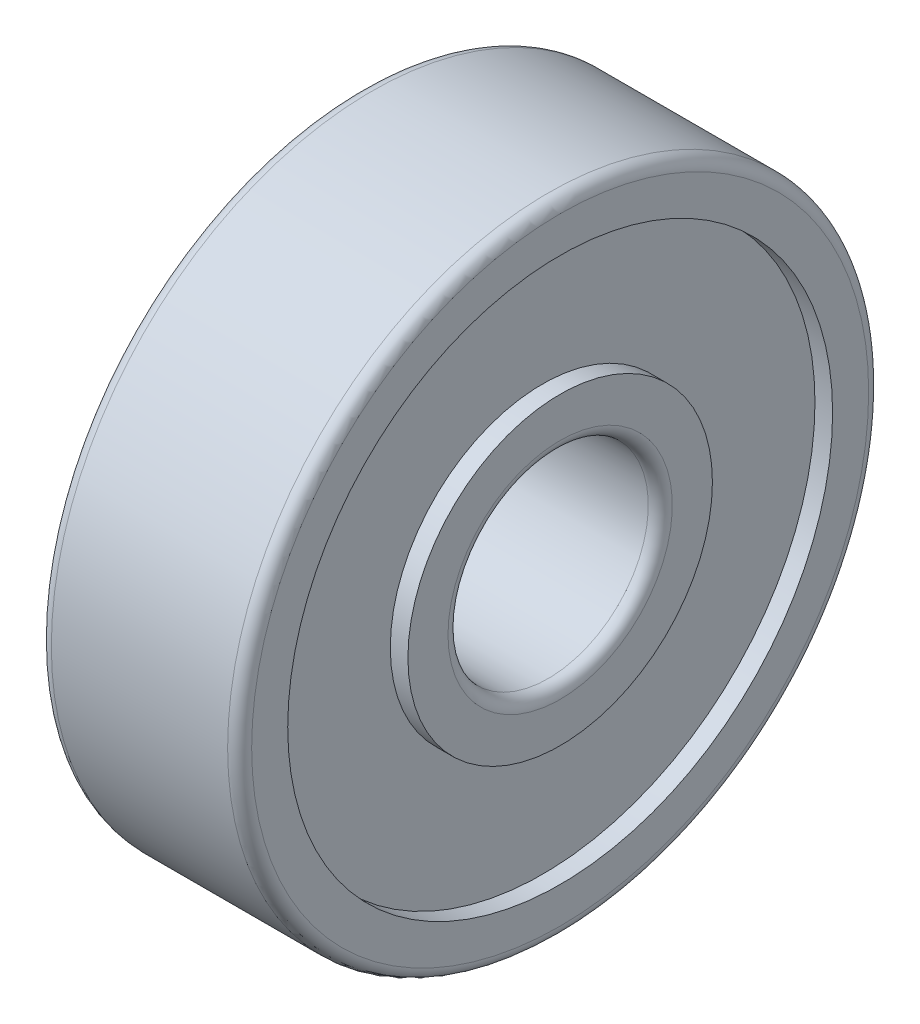
ISO-10303-21;
HEADER;
FILE_DESCRIPTION(('STEP AP214'),'2;1');
FILE_NAME('part.step','',(''),(''),'','','');
FILE_SCHEMA(('AUTOMOTIVE_DESIGN { 1 0 10303 214 1 1 1 1 }'));
ENDSEC;
DATA;
#1=APPLICATION_CONTEXT('core data for automotive mechanical design processes');
#2=APPLICATION_PROTOCOL_DEFINITION('international standard','automotive_design',2000,#1);
#3=PRODUCT_CONTEXT('',#1,'mechanical');
#4=PRODUCT('Part','Part','',(#3));
#5=PRODUCT_RELATED_PRODUCT_CATEGORY('part','',(#4));
#6=PRODUCT_DEFINITION_FORMATION('','',#4);
#7=PRODUCT_DEFINITION_CONTEXT('part definition',#1,'design');
#8=PRODUCT_DEFINITION('design','',#6,#7);
#9=PRODUCT_DEFINITION_SHAPE('','',#8);
#10=(LENGTH_UNIT() NAMED_UNIT(*) SI_UNIT(.MILLI.,.METRE.));
#11=(NAMED_UNIT(*) PLANE_ANGLE_UNIT() SI_UNIT($,.RADIAN.));
#12=(NAMED_UNIT(*) SI_UNIT($,.STERADIAN.) SOLID_ANGLE_UNIT());
#13=UNCERTAINTY_MEASURE_WITH_UNIT(LENGTH_MEASURE(1.E-05),#10,'distance_accuracy_value','');
#14=(GEOMETRIC_REPRESENTATION_CONTEXT(3) GLOBAL_UNCERTAINTY_ASSIGNED_CONTEXT((#13)) GLOBAL_UNIT_ASSIGNED_CONTEXT((#10,
#11,#12)) REPRESENTATION_CONTEXT('',''));
#15=CARTESIAN_POINT('',(0.,0.,0.));
#16=DIRECTION('',(0.,0.,1.));
#17=DIRECTION('',(1.,0.,0.));
#18=AXIS2_PLACEMENT_3D('',#15,#16,#17);
#19=CARTESIAN_POINT('',(0.299999999999941,0.,0.));
#20=DIRECTION('',(-1.,0.,0.));
#21=DIRECTION('',(0.,0.,1.));
#22=AXIS2_PLACEMENT_3D('',#19,#20,#21);
#23=TOROIDAL_SURFACE('',#22,7.70000000000006,0.299999999999941);
#24=CARTESIAN_POINT('',(0.,0.,0.));
#25=DIRECTION('',(-1.,0.,0.));
#26=DIRECTION('',(0.,0.,1.));
#27=AXIS2_PLACEMENT_3D('',#24,#25,#26);
#28=CIRCLE('',#27,7.7);
#29=CARTESIAN_POINT('',(0.,0.,7.7));
#30=VERTEX_POINT('',#29);
#31=EDGE_CURVE('E10',#30,#30,#28,.T.);
#32=ORIENTED_EDGE('',*,*,#31,.F.);
#33=EDGE_LOOP('',(#32));
#34=FACE_BOUND('',#33,.T.);
#35=CARTESIAN_POINT('',(0.3,0.,0.));
#36=DIRECTION('',(-1.,0.,0.));
#37=DIRECTION('',(0.,0.,1.));
#38=AXIS2_PLACEMENT_3D('',#35,#36,#37);
#39=CIRCLE('',#38,8.);
#40=CARTESIAN_POINT('',(0.3,0.,8.));
#41=VERTEX_POINT('',#40);
#42=EDGE_CURVE('E83',#41,#41,#39,.T.);
#43=ORIENTED_EDGE('',*,*,#42,.T.);
#44=EDGE_LOOP('',(#43));
#45=FACE_BOUND('',#44,.T.);
#46=ADVANCED_FACE('F31',(#34,#45),#23,.T.);
#47=CARTESIAN_POINT('',(0.,7.7,0.));
#48=DIRECTION('',(1.,0.,0.));
#49=DIRECTION('',(0.,0.,-1.));
#50=AXIS2_PLACEMENT_3D('',#47,#48,#49);
#51=PLANE('',#50);
#52=CARTESIAN_POINT('',(0.,0.,0.));
#53=DIRECTION('',(-1.,0.,0.));
#54=DIRECTION('',(0.,0.,1.));
#55=AXIS2_PLACEMENT_3D('',#52,#53,#54);
#56=CIRCLE('',#55,6.8);
#57=CARTESIAN_POINT('',(0.,0.,6.8));
#58=VERTEX_POINT('',#57);
#59=EDGE_CURVE('E37',#58,#58,#56,.T.);
#60=ORIENTED_EDGE('',*,*,#59,.F.);
#61=EDGE_LOOP('',(#60));
#62=FACE_BOUND('',#61,.T.);
#63=ORIENTED_EDGE('',*,*,#31,.T.);
#64=EDGE_LOOP('',(#63));
#65=FACE_BOUND('',#64,.T.);
#66=ADVANCED_FACE('F168',(#62,#65),#51,.F.);
#67=CARTESIAN_POINT('',(4.7,0.,0.));
#68=DIRECTION('',(-1.,0.,0.));
#69=DIRECTION('',(0.,0.,1.));
#70=AXIS2_PLACEMENT_3D('',#67,#68,#69);
#71=CYLINDRICAL_SURFACE('',#70,6.8);
#72=CARTESIAN_POINT('',(0.44,0.,0.));
#73=DIRECTION('',(-1.,0.,0.));
#74=DIRECTION('',(0.,0.,1.));
#75=AXIS2_PLACEMENT_3D('',#72,#73,#74);
#76=CIRCLE('',#75,6.8);
#77=CARTESIAN_POINT('',(0.44,0.,6.8));
#78=VERTEX_POINT('',#77);
#79=EDGE_CURVE('E41',#78,#78,#76,.T.);
#80=ORIENTED_EDGE('',*,*,#79,.F.);
#81=EDGE_LOOP('',(#80));
#82=FACE_BOUND('',#81,.T.);
#83=ORIENTED_EDGE('',*,*,#59,.T.);
#84=EDGE_LOOP('',(#83));
#85=FACE_BOUND('',#84,.T.);
#86=ADVANCED_FACE('F163',(#82,#85),#71,.F.);
#87=CARTESIAN_POINT('',(0.44,6.8,0.));
#88=DIRECTION('',(1.,0.,0.));
#89=DIRECTION('',(0.,0.,-1.));
#90=AXIS2_PLACEMENT_3D('',#87,#88,#89);
#91=PLANE('',#90);
#92=CARTESIAN_POINT('',(0.44,0.,0.));
#93=DIRECTION('',(-1.,0.,0.));
#94=DIRECTION('',(0.,0.,1.));
#95=AXIS2_PLACEMENT_3D('',#92,#93,#94);
#96=CIRCLE('',#95,3.8);
#97=CARTESIAN_POINT('',(0.44,0.,3.8));
#98=VERTEX_POINT('',#97);
#99=EDGE_CURVE('E45',#98,#98,#96,.T.);
#100=ORIENTED_EDGE('',*,*,#99,.F.);
#101=EDGE_LOOP('',(#100));
#102=FACE_BOUND('',#101,.T.);
#103=ORIENTED_EDGE('',*,*,#79,.T.);
#104=EDGE_LOOP('',(#103));
#105=FACE_BOUND('',#104,.T.);
#106=ADVANCED_FACE('F157',(#102,#105),#91,.F.);
#107=CARTESIAN_POINT('',(4.7,0.,0.));
#108=DIRECTION('',(-1.,0.,0.));
#109=DIRECTION('',(0.,0.,1.));
#110=AXIS2_PLACEMENT_3D('',#107,#108,#109);
#111=CYLINDRICAL_SURFACE('',#110,3.8);
#112=CARTESIAN_POINT('',(0.,0.,0.));
#113=DIRECTION('',(-1.,0.,0.));
#114=DIRECTION('',(0.,0.,1.));
#115=AXIS2_PLACEMENT_3D('',#112,#113,#114);
#116=CIRCLE('',#115,3.8);
#117=CARTESIAN_POINT('',(0.,0.,3.8));
#118=VERTEX_POINT('',#117);
#119=EDGE_CURVE('E50',#118,#118,#116,.T.);
#120=ORIENTED_EDGE('',*,*,#119,.F.);
#121=EDGE_LOOP('',(#120));
#122=FACE_BOUND('',#121,.T.);
#123=ORIENTED_EDGE('',*,*,#99,.T.);
#124=EDGE_LOOP('',(#123));
#125=FACE_BOUND('',#124,.T.);
#126=ADVANCED_FACE('F151',(#122,#125),#111,.T.);
#127=CARTESIAN_POINT('',(0.,3.8,0.));
#128=DIRECTION('',(1.,0.,0.));
#129=DIRECTION('',(0.,0.,-1.));
#130=AXIS2_PLACEMENT_3D('',#127,#128,#129);
#131=PLANE('',#130);
#132=CARTESIAN_POINT('',(0.,0.,0.));
#133=DIRECTION('',(-1.,0.,0.));
#134=DIRECTION('',(0.,0.,1.));
#135=AXIS2_PLACEMENT_3D('',#132,#133,#134);
#136=CIRCLE('',#135,2.8);
#137=CARTESIAN_POINT('',(0.,0.,2.8));
#138=VERTEX_POINT('',#137);
#139=EDGE_CURVE('E53',#138,#138,#136,.T.);
#140=ORIENTED_EDGE('',*,*,#139,.F.);
#141=EDGE_LOOP('',(#140));
#142=FACE_BOUND('',#141,.T.);
#143=ORIENTED_EDGE('',*,*,#119,.T.);
#144=EDGE_LOOP('',(#143));
#145=FACE_BOUND('',#144,.T.);
#146=ADVANCED_FACE('F145',(#142,#145),#131,.F.);
#147=CARTESIAN_POINT('',(0.299999999999939,0.,0.));
#148=DIRECTION('',(-1.,0.,0.));
#149=DIRECTION('',(0.,0.,1.));
#150=AXIS2_PLACEMENT_3D('',#147,#148,#149);
#151=TOROIDAL_SURFACE('',#150,2.79999999999994,0.299999999999939);
#152=CARTESIAN_POINT('',(0.3,0.,0.));
#153=DIRECTION('',(-1.,0.,0.));
#154=DIRECTION('',(0.,0.,1.));
#155=AXIS2_PLACEMENT_3D('',#152,#153,#154);
#156=CIRCLE('',#155,2.5);
#157=CARTESIAN_POINT('',(0.3,0.,2.5));
#158=VERTEX_POINT('',#157);
#159=EDGE_CURVE('E56',#158,#158,#156,.T.);
#160=ORIENTED_EDGE('',*,*,#159,.F.);
#161=EDGE_LOOP('',(#160));
#162=FACE_BOUND('',#161,.T.);
#163=ORIENTED_EDGE('',*,*,#139,.T.);
#164=EDGE_LOOP('',(#163));
#165=FACE_BOUND('',#164,.T.);
#166=ADVANCED_FACE('F139',(#162,#165),#151,.T.);
#167=CARTESIAN_POINT('',(4.7,0.,0.));
#168=DIRECTION('',(-1.,0.,0.));
#169=DIRECTION('',(0.,0.,1.));
#170=AXIS2_PLACEMENT_3D('',#167,#168,#169);
#171=CYLINDRICAL_SURFACE('',#170,2.5);
#172=CARTESIAN_POINT('',(4.7,0.,0.));
#173=DIRECTION('',(-1.,0.,0.));
#174=DIRECTION('',(0.,0.,1.));
#175=AXIS2_PLACEMENT_3D('',#172,#173,#174);
#176=CIRCLE('',#175,2.5);
#177=CARTESIAN_POINT('',(4.7,0.,2.5));
#178=VERTEX_POINT('',#177);
#179=EDGE_CURVE('E59',#178,#178,#176,.T.);
#180=ORIENTED_EDGE('',*,*,#179,.F.);
#181=EDGE_LOOP('',(#180));
#182=FACE_BOUND('',#181,.T.);
#183=ORIENTED_EDGE('',*,*,#159,.T.);
#184=EDGE_LOOP('',(#183));
#185=FACE_BOUND('',#184,.T.);
#186=ADVANCED_FACE('F133',(#182,#185),#171,.F.);
#187=CARTESIAN_POINT('',(4.70000000000012,0.,0.));
#188=DIRECTION('',(-1.,0.,0.));
#189=DIRECTION('',(0.,0.,1.));
#190=AXIS2_PLACEMENT_3D('',#187,#188,#189);
#191=TOROIDAL_SURFACE('',#190,2.79999999999988,0.299999999999878);
#192=CARTESIAN_POINT('',(5.,0.,0.));
#193=DIRECTION('',(-1.,0.,0.));
#194=DIRECTION('',(0.,0.,1.));
#195=AXIS2_PLACEMENT_3D('',#192,#193,#194);
#196=CIRCLE('',#195,2.8);
#197=CARTESIAN_POINT('',(5.,0.,2.8));
#198=VERTEX_POINT('',#197);
#199=EDGE_CURVE('E62',#198,#198,#196,.T.);
#200=ORIENTED_EDGE('',*,*,#199,.F.);
#201=EDGE_LOOP('',(#200));
#202=FACE_BOUND('',#201,.T.);
#203=ORIENTED_EDGE('',*,*,#179,.T.);
#204=EDGE_LOOP('',(#203));
#205=FACE_BOUND('',#204,.T.);
#206=ADVANCED_FACE('F127',(#202,#205),#191,.T.);
#207=CARTESIAN_POINT('',(5.,2.8,0.));
#208=DIRECTION('',(-1.,0.,0.));
#209=DIRECTION('',(0.,0.,1.));
#210=AXIS2_PLACEMENT_3D('',#207,#208,#209);
#211=PLANE('',#210);
#212=CARTESIAN_POINT('',(5.,0.,0.));
#213=DIRECTION('',(-1.,0.,0.));
#214=DIRECTION('',(0.,0.,1.));
#215=AXIS2_PLACEMENT_3D('',#212,#213,#214);
#216=CIRCLE('',#215,3.8);
#217=CARTESIAN_POINT('',(5.,0.,3.8));
#218=VERTEX_POINT('',#217);
#219=EDGE_CURVE('E65',#218,#218,#216,.T.);
#220=ORIENTED_EDGE('',*,*,#219,.F.);
#221=EDGE_LOOP('',(#220));
#222=FACE_BOUND('',#221,.T.);
#223=ORIENTED_EDGE('',*,*,#199,.T.);
#224=EDGE_LOOP('',(#223));
#225=FACE_BOUND('',#224,.T.);
#226=ADVANCED_FACE('F121',(#222,#225),#211,.F.);
#227=CARTESIAN_POINT('',(4.7,0.,0.));
#228=DIRECTION('',(-1.,0.,0.));
#229=DIRECTION('',(0.,0.,1.));
#230=AXIS2_PLACEMENT_3D('',#227,#228,#229);
#231=CYLINDRICAL_SURFACE('',#230,3.8);
#232=CARTESIAN_POINT('',(4.56,0.,0.));
#233=DIRECTION('',(-1.,0.,0.));
#234=DIRECTION('',(0.,0.,1.));
#235=AXIS2_PLACEMENT_3D('',#232,#233,#234);
#236=CIRCLE('',#235,3.8);
#237=CARTESIAN_POINT('',(4.56,0.,3.8));
#238=VERTEX_POINT('',#237);
#239=EDGE_CURVE('E68',#238,#238,#236,.T.);
#240=ORIENTED_EDGE('',*,*,#239,.F.);
#241=EDGE_LOOP('',(#240));
#242=FACE_BOUND('',#241,.T.);
#243=ORIENTED_EDGE('',*,*,#219,.T.);
#244=EDGE_LOOP('',(#243));
#245=FACE_BOUND('',#244,.T.);
#246=ADVANCED_FACE('F115',(#242,#245),#231,.T.);
#247=CARTESIAN_POINT('',(4.56,3.8,0.));
#248=DIRECTION('',(-1.,0.,0.));
#249=DIRECTION('',(0.,0.,1.));
#250=AXIS2_PLACEMENT_3D('',#247,#248,#249);
#251=PLANE('',#250);
#252=CARTESIAN_POINT('',(4.56,0.,0.));
#253=DIRECTION('',(-1.,0.,0.));
#254=DIRECTION('',(0.,0.,1.));
#255=AXIS2_PLACEMENT_3D('',#252,#253,#254);
#256=CIRCLE('',#255,6.8);
#257=CARTESIAN_POINT('',(4.56,0.,6.8));
#258=VERTEX_POINT('',#257);
#259=EDGE_CURVE('E71',#258,#258,#256,.T.);
#260=ORIENTED_EDGE('',*,*,#259,.F.);
#261=EDGE_LOOP('',(#260));
#262=FACE_BOUND('',#261,.T.);
#263=ORIENTED_EDGE('',*,*,#239,.T.);
#264=EDGE_LOOP('',(#263));
#265=FACE_BOUND('',#264,.T.);
#266=ADVANCED_FACE('F109',(#262,#265),#251,.F.);
#267=CARTESIAN_POINT('',(4.7,0.,0.));
#268=DIRECTION('',(-1.,0.,0.));
#269=DIRECTION('',(0.,0.,1.));
#270=AXIS2_PLACEMENT_3D('',#267,#268,#269);
#271=CYLINDRICAL_SURFACE('',#270,6.8);
#272=CARTESIAN_POINT('',(5.,0.,0.));
#273=DIRECTION('',(-1.,0.,0.));
#274=DIRECTION('',(0.,0.,1.));
#275=AXIS2_PLACEMENT_3D('',#272,#273,#274);
#276=CIRCLE('',#275,6.8);
#277=CARTESIAN_POINT('',(5.,0.,6.8));
#278=VERTEX_POINT('',#277);
#279=EDGE_CURVE('E74',#278,#278,#276,.T.);
#280=ORIENTED_EDGE('',*,*,#279,.F.);
#281=EDGE_LOOP('',(#280));
#282=FACE_BOUND('',#281,.T.);
#283=ORIENTED_EDGE('',*,*,#259,.T.);
#284=EDGE_LOOP('',(#283));
#285=FACE_BOUND('',#284,.T.);
#286=ADVANCED_FACE('F103',(#282,#285),#271,.F.);
#287=CARTESIAN_POINT('',(5.,6.8,0.));
#288=DIRECTION('',(-1.,0.,0.));
#289=DIRECTION('',(0.,0.,1.));
#290=AXIS2_PLACEMENT_3D('',#287,#288,#289);
#291=PLANE('',#290);
#292=CARTESIAN_POINT('',(5.,0.,0.));
#293=DIRECTION('',(-1.,0.,0.));
#294=DIRECTION('',(0.,0.,1.));
#295=AXIS2_PLACEMENT_3D('',#292,#293,#294);
#296=CIRCLE('',#295,7.7);
#297=CARTESIAN_POINT('',(5.,0.,7.7));
#298=VERTEX_POINT('',#297);
#299=EDGE_CURVE('E77',#298,#298,#296,.T.);
#300=ORIENTED_EDGE('',*,*,#299,.F.);
#301=EDGE_LOOP('',(#300));
#302=FACE_BOUND('',#301,.T.);
#303=ORIENTED_EDGE('',*,*,#279,.T.);
#304=EDGE_LOOP('',(#303));
#305=FACE_BOUND('',#304,.T.);
#306=ADVANCED_FACE('F97',(#302,#305),#291,.F.);
#307=CARTESIAN_POINT('',(4.70000000000012,0.,0.));
#308=DIRECTION('',(-1.,0.,0.));
#309=DIRECTION('',(0.,0.,1.));
#310=AXIS2_PLACEMENT_3D('',#307,#308,#309);
#311=TOROIDAL_SURFACE('',#310,7.70000000000012,0.299999999999879);
#312=CARTESIAN_POINT('',(4.7,0.,0.));
#313=DIRECTION('',(-1.,0.,0.));
#314=DIRECTION('',(0.,0.,1.));
#315=AXIS2_PLACEMENT_3D('',#312,#313,#314);
#316=CIRCLE('',#315,8.);
#317=CARTESIAN_POINT('',(4.7,0.,8.));
#318=VERTEX_POINT('',#317);
#319=EDGE_CURVE('E80',#318,#318,#316,.T.);
#320=ORIENTED_EDGE('',*,*,#319,.F.);
#321=EDGE_LOOP('',(#320));
#322=FACE_BOUND('',#321,.T.);
#323=ORIENTED_EDGE('',*,*,#299,.T.);
#324=EDGE_LOOP('',(#323));
#325=FACE_BOUND('',#324,.T.);
#326=ADVANCED_FACE('F91',(#322,#325),#311,.T.);
#327=CARTESIAN_POINT('',(4.7,0.,0.));
#328=DIRECTION('',(-1.,0.,0.));
#329=DIRECTION('',(0.,0.,1.));
#330=AXIS2_PLACEMENT_3D('',#327,#328,#329);
#331=CYLINDRICAL_SURFACE('',#330,8.);
#332=ORIENTED_EDGE('',*,*,#42,.F.);
#333=EDGE_LOOP('',(#332));
#334=FACE_BOUND('',#333,.T.);
#335=ORIENTED_EDGE('',*,*,#319,.T.);
#336=EDGE_LOOP('',(#335));
#337=FACE_BOUND('',#336,.T.);
#338=ADVANCED_FACE('F88',(#334,#337),#331,.T.);
#339=CLOSED_SHELL('',(#46,#66,#86,#106,#126,#146,#166,#186,#206,#226,#246,#266,#286,#306,#326,#338));
#340=MANIFOLD_SOLID_BREP('B2',#339);
#341=ADVANCED_BREP_SHAPE_REPRESENTATION('',(#18,#340),#14);
#342=SHAPE_DEFINITION_REPRESENTATION(#9,#341);
ENDSEC;
END-ISO-10303-21;
